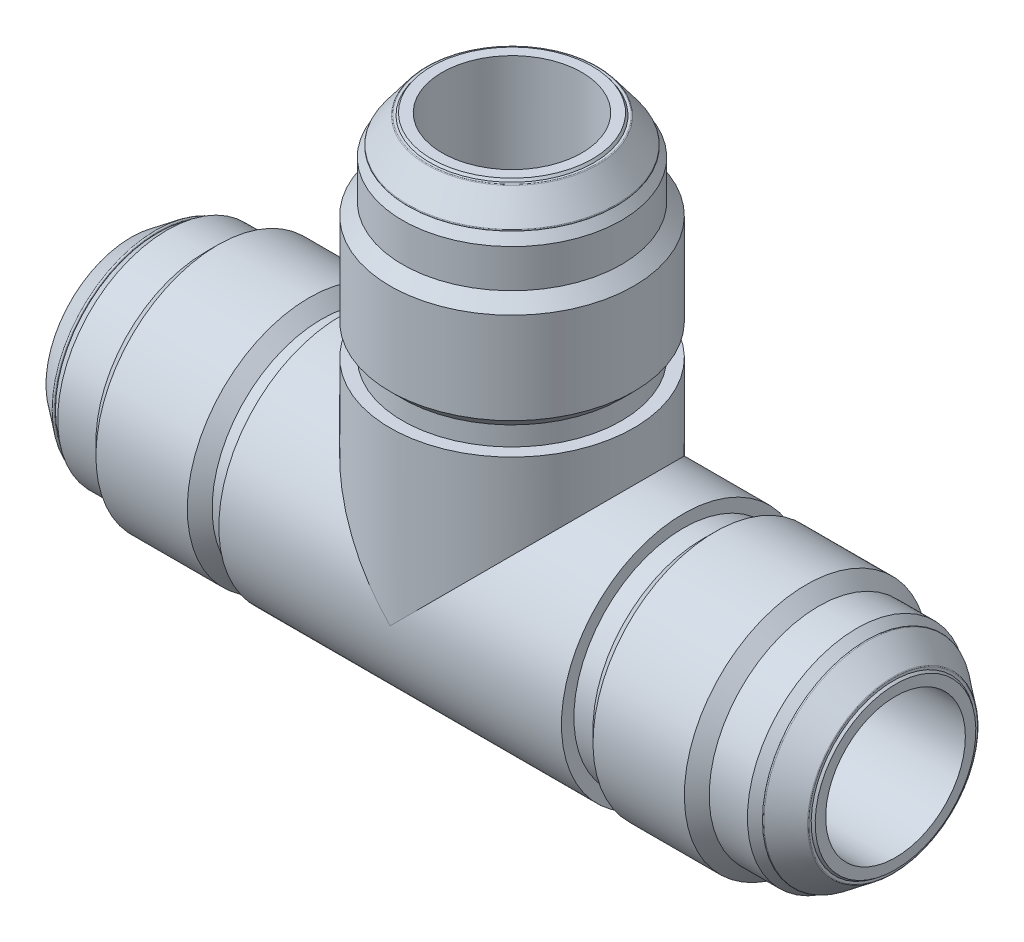
ISO-10303-21;
HEADER;
FILE_DESCRIPTION(('STEP AP214'),'2;1');
FILE_NAME('part.step','',(''),(''),'','','');
FILE_SCHEMA(('AUTOMOTIVE_DESIGN { 1 0 10303 214 1 1 1 1 }'));
ENDSEC;
DATA;
#1=APPLICATION_CONTEXT('core data for automotive mechanical design processes');
#2=APPLICATION_PROTOCOL_DEFINITION('international standard','automotive_design',2000,#1);
#3=PRODUCT_CONTEXT('',#1,'mechanical');
#4=PRODUCT('Part','Part','',(#3));
#5=PRODUCT_RELATED_PRODUCT_CATEGORY('part','',(#4));
#6=PRODUCT_DEFINITION_FORMATION('','',#4);
#7=PRODUCT_DEFINITION_CONTEXT('part definition',#1,'design');
#8=PRODUCT_DEFINITION('design','',#6,#7);
#9=PRODUCT_DEFINITION_SHAPE('','',#8);
#10=(LENGTH_UNIT() NAMED_UNIT(*) SI_UNIT(.MILLI.,.METRE.));
#11=(NAMED_UNIT(*) PLANE_ANGLE_UNIT() SI_UNIT($,.RADIAN.));
#12=(NAMED_UNIT(*) SI_UNIT($,.STERADIAN.) SOLID_ANGLE_UNIT());
#13=UNCERTAINTY_MEASURE_WITH_UNIT(LENGTH_MEASURE(1.E-05),#10,'distance_accuracy_value','');
#14=(GEOMETRIC_REPRESENTATION_CONTEXT(3) GLOBAL_UNCERTAINTY_ASSIGNED_CONTEXT((#13)) GLOBAL_UNIT_ASSIGNED_CONTEXT((#10,
#11,#12)) REPRESENTATION_CONTEXT('',''));
#15=CARTESIAN_POINT('',(0.,0.,0.));
#16=DIRECTION('',(0.,0.,1.));
#17=DIRECTION('',(1.,0.,0.));
#18=AXIS2_PLACEMENT_3D('',#15,#16,#17);
#19=CARTESIAN_POINT('',(0.,0.,0.));
#20=DIRECTION('',(0.,1.,0.));
#21=DIRECTION('',(0.,0.,1.));
#22=AXIS2_PLACEMENT_3D('',#19,#20,#21);
#23=CYLINDRICAL_SURFACE('',#22,13.49375);
#24=CARTESIAN_POINT('',(0.,18.970625,0.));
#25=DIRECTION('',(0.,-1.,0.));
#26=DIRECTION('',(0.,0.,-1.));
#27=AXIS2_PLACEMENT_3D('',#24,#25,#26);
#28=CIRCLE('',#27,13.49375);
#29=CARTESIAN_POINT('',(0.,18.970625,-13.49375));
#30=VERTEX_POINT('',#29);
#31=EDGE_CURVE('E173',#30,#30,#28,.T.);
#32=ORIENTED_EDGE('',*,*,#31,.T.);
#33=EDGE_LOOP('',(#32));
#34=FACE_BOUND('',#33,.T.);
#35=CARTESIAN_POINT('',(0.,0.,0.));
#36=DIRECTION('',(-0.707106781186546,0.707106781186549,0.));
#37=DIRECTION('',(0.707106781186549,0.707106781186546,0.));
#38=AXIS2_PLACEMENT_3D('',#35,#36,#37);
#39=ELLIPSE('',#38,19.083044257272,13.49375);
#40=CARTESIAN_POINT('',(0.,0.,-13.49375));
#41=VERTEX_POINT('',#40);
#42=CARTESIAN_POINT('',(0.,0.,13.49375));
#43=VERTEX_POINT('',#42);
#44=EDGE_CURVE('E168',#41,#43,#39,.F.);
#45=ORIENTED_EDGE('',*,*,#44,.F.);
#46=CARTESIAN_POINT('',(0.,0.,0.));
#47=DIRECTION('',(0.707106781186549,0.707106781186546,0.));
#48=DIRECTION('',(-0.707106781186546,0.707106781186549,0.));
#49=AXIS2_PLACEMENT_3D('',#46,#47,#48);
#50=ELLIPSE('',#49,19.0830442572719,13.49375);
#51=EDGE_CURVE('E59',#43,#41,#50,.F.);
#52=ORIENTED_EDGE('',*,*,#51,.F.);
#53=EDGE_LOOP('',(#45,#52));
#54=FACE_BOUND('',#53,.T.);
#55=ADVANCED_FACE('F40',(#34,#54),#23,.T.);
#56=CARTESIAN_POINT('',(1.4826793722981E-13,42.465625,0.));
#57=DIRECTION('',(0.,-1.,0.));
#58=DIRECTION('',(0.,0.,-1.));
#59=AXIS2_PLACEMENT_3D('',#56,#57,#58);
#60=CYLINDRICAL_SURFACE('',#59,7.7343);
#61=CARTESIAN_POINT('',(1.4826793722981E-13,42.465625,0.));
#62=DIRECTION('',(0.,-1.,0.));
#63=DIRECTION('',(0.,0.,-1.));
#64=AXIS2_PLACEMENT_3D('',#61,#62,#63);
#65=CIRCLE('',#64,7.7343);
#66=CARTESIAN_POINT('',(1.4826793722981E-13,42.465625,-7.7343));
#67=VERTEX_POINT('',#66);
#68=EDGE_CURVE('E170',#67,#67,#65,.T.);
#69=ORIENTED_EDGE('',*,*,#68,.F.);
#70=EDGE_LOOP('',(#69));
#71=FACE_BOUND('',#70,.T.);
#72=CARTESIAN_POINT('',(0.,0.,0.));
#73=DIRECTION('',(-0.707106781186549,-0.707106781186546,0.));
#74=DIRECTION('',(-0.707106781186546,0.707106781186549,0.));
#75=AXIS2_PLACEMENT_3D('',#72,#73,#74);
#76=ELLIPSE('',#75,10.9379519554622,7.7343);
#77=CARTESIAN_POINT('',(0.,0.,-7.7343));
#78=VERTEX_POINT('',#77);
#79=CARTESIAN_POINT('',(0.,0.,7.7343));
#80=VERTEX_POINT('',#79);
#81=EDGE_CURVE('E48',#78,#80,#76,.F.);
#82=ORIENTED_EDGE('',*,*,#81,.F.);
#83=CARTESIAN_POINT('',(0.,0.,0.));
#84=DIRECTION('',(-0.707106781186546,0.707106781186549,0.));
#85=DIRECTION('',(-0.707106781186549,-0.707106781186546,0.));
#86=AXIS2_PLACEMENT_3D('',#83,#84,#85);
#87=ELLIPSE('',#86,10.9379519554622,7.7343);
#88=EDGE_CURVE('E11',#80,#78,#87,.T.);
#89=ORIENTED_EDGE('',*,*,#88,.F.);
#90=EDGE_LOOP('',(#82,#89));
#91=FACE_BOUND('',#90,.T.);
#92=ADVANCED_FACE('F64',(#71,#91),#60,.F.);
#93=CARTESIAN_POINT('',(0.,18.970625,0.));
#94=DIRECTION('',(0.,1.,0.));
#95=DIRECTION('',(0.,0.,1.));
#96=AXIS2_PLACEMENT_3D('',#93,#94,#95);
#97=CYLINDRICAL_SURFACE('',#96,13.49375);
#98=CARTESIAN_POINT('',(0.,22.4621069951745,0.));
#99=DIRECTION('',(0.,-1.,0.));
#100=DIRECTION('',(1.,0.,0.));
#101=AXIS2_PLACEMENT_3D('',#98,#99,#100);
#102=CIRCLE('',#101,13.49375);
#103=CARTESIAN_POINT('',(13.4937500000001,22.4621069951744,0.));
#104=VERTEX_POINT('',#103);
#105=EDGE_CURVE('E182',#104,#104,#102,.T.);
#106=ORIENTED_EDGE('',*,*,#105,.F.);
#107=EDGE_LOOP('',(#106));
#108=FACE_BOUND('',#107,.T.);
#109=CARTESIAN_POINT('',(1.10767937361949E-13,32.5784340172366,0.));
#110=DIRECTION('',(0.,-1.,0.));
#111=DIRECTION('',(1.,0.,0.));
#112=AXIS2_PLACEMENT_3D('',#109,#110,#111);
#113=CIRCLE('',#112,13.49375);
#114=CARTESIAN_POINT('',(13.4937500000001,32.5784340172365,0.));
#115=VERTEX_POINT('',#114);
#116=EDGE_CURVE('E185',#115,#115,#113,.T.);
#117=ORIENTED_EDGE('',*,*,#116,.T.);
#118=EDGE_LOOP('',(#117));
#119=FACE_BOUND('',#118,.T.);
#120=ADVANCED_FACE('F42',(#108,#119),#97,.T.);
#121=CARTESIAN_POINT('',(1.15442362722966E-13,33.9532493457444,0.));
#122=DIRECTION('',(0.,-1.,0.));
#123=DIRECTION('',(1.,0.,0.));
#124=AXIS2_PLACEMENT_3D('',#121,#122,#123);
#125=CONICAL_SURFACE('',#124,12.1189346714922,0.78539816339745);
#126=ORIENTED_EDGE('',*,*,#116,.F.);
#127=EDGE_LOOP('',(#126));
#128=FACE_BOUND('',#127,.T.);
#129=CARTESIAN_POINT('',(1.15442362722966E-13,33.9532493457444,0.));
#130=DIRECTION('',(0.,-1.,0.));
#131=DIRECTION('',(1.,0.,0.));
#132=AXIS2_PLACEMENT_3D('',#129,#130,#131);
#133=CIRCLE('',#132,12.1189346714922);
#134=CARTESIAN_POINT('',(12.1189346714923,33.9532493457444,0.));
#135=VERTEX_POINT('',#134);
#136=EDGE_CURVE('E66',#135,#135,#133,.T.);
#137=ORIENTED_EDGE('',*,*,#136,.T.);
#138=EDGE_LOOP('',(#137));
#139=FACE_BOUND('',#138,.T.);
#140=ADVANCED_FACE('F215',(#128,#139),#125,.T.);
#141=CARTESIAN_POINT('',(0.,0.,0.));
#142=DIRECTION('',(0.,-1.,0.));
#143=DIRECTION('',(1.,0.,0.));
#144=AXIS2_PLACEMENT_3D('',#141,#142,#143);
#145=CYLINDRICAL_SURFACE('',#144,12.1189346714922);
#146=ORIENTED_EDGE('',*,*,#136,.F.);
#147=EDGE_LOOP('',(#146));
#148=FACE_BOUND('',#147,.T.);
#149=CARTESIAN_POINT('',(1.2983586000558E-13,38.1865826790777,0.));
#150=DIRECTION('',(0.,-1.,0.));
#151=DIRECTION('',(1.,0.,0.));
#152=AXIS2_PLACEMENT_3D('',#149,#150,#151);
#153=CIRCLE('',#152,12.1189346714922);
#154=CARTESIAN_POINT('',(12.1189346714923,38.1865826790777,0.));
#155=VERTEX_POINT('',#154);
#156=EDGE_CURVE('E209',#155,#155,#153,.T.);
#157=ORIENTED_EDGE('',*,*,#156,.T.);
#158=EDGE_LOOP('',(#157));
#159=FACE_BOUND('',#158,.T.);
#160=ADVANCED_FACE('F217',(#148,#159),#145,.T.);
#161=CARTESIAN_POINT('',(1.33290299353407E-13,39.2025826790777,0.));
#162=DIRECTION('',(0.,-1.,0.));
#163=DIRECTION('',(1.,0.,0.));
#164=AXIS2_PLACEMENT_3D('',#161,#162,#163);
#165=CONICAL_SURFACE('',#164,11.3533237565878,0.645771823237896);
#166=ORIENTED_EDGE('',*,*,#156,.F.);
#167=EDGE_LOOP('',(#166));
#168=FACE_BOUND('',#167,.T.);
#169=CARTESIAN_POINT('',(1.33290299353407E-13,39.2025826790777,0.));
#170=DIRECTION('',(0.,-1.,0.));
#171=DIRECTION('',(1.,0.,0.));
#172=AXIS2_PLACEMENT_3D('',#169,#170,#171);
#173=CIRCLE('',#172,11.3533237565878);
#174=CARTESIAN_POINT('',(11.3533237565879,39.2025826790777,0.));
#175=VERTEX_POINT('',#174);
#176=EDGE_CURVE('E206',#175,#175,#173,.T.);
#177=ORIENTED_EDGE('',*,*,#176,.T.);
#178=EDGE_LOOP('',(#177));
#179=FACE_BOUND('',#178,.T.);
#180=ADVANCED_FACE('F220',(#168,#179),#165,.T.);
#181=CARTESIAN_POINT('',(11.4166436208107,39.2025826790777,0.));
#182=DIRECTION('',(0.,1.,0.));
#183=DIRECTION('',(-1.,0.,0.));
#184=AXIS2_PLACEMENT_3D('',#181,#182,#183);
#185=PLANE('',#184);
#186=ORIENTED_EDGE('',*,*,#176,.F.);
#187=EDGE_LOOP('',(#186));
#188=FACE_BOUND('',#187,.T.);
#189=CARTESIAN_POINT('',(1.33290299353407E-13,39.2025826790777,0.));
#190=DIRECTION('',(0.,-1.,0.));
#191=DIRECTION('',(1.,0.,0.));
#192=AXIS2_PLACEMENT_3D('',#189,#190,#191);
#193=CIRCLE('',#192,11.4166436208106);
#194=CARTESIAN_POINT('',(11.4166436208107,39.2025826790777,0.));
#195=VERTEX_POINT('',#194);
#196=EDGE_CURVE('E203',#195,#195,#193,.T.);
#197=ORIENTED_EDGE('',*,*,#196,.T.);
#198=EDGE_LOOP('',(#197));
#199=FACE_BOUND('',#198,.T.);
#200=ADVANCED_FACE('F226',(#188,#199),#185,.F.);
#201=CARTESIAN_POINT('',(1.33849057036534E-13,39.3295826790777,0.));
#202=DIRECTION('',(0.,-1.,0.));
#203=DIRECTION('',(1.,0.,0.));
#204=AXIS2_PLACEMENT_3D('',#201,#202,#203);
#205=TOROIDAL_SURFACE('',#204,11.4166436208106,0.127000000000006);
#206=ORIENTED_EDGE('',*,*,#196,.F.);
#207=EDGE_LOOP('',(#206));
#208=FACE_BOUND('',#207,.T.);
#209=CARTESIAN_POINT('',(1.33981970958897E-13,39.4060131870181,0.));
#210=DIRECTION('',(0.,-1.,0.));
#211=DIRECTION('',(1.,0.,0.));
#212=AXIS2_PLACEMENT_3D('',#209,#210,#211);
#213=CIRCLE('',#212,11.5180703305866);
#214=CARTESIAN_POINT('',(11.5180703305867,39.406013187018,0.));
#215=VERTEX_POINT('',#214);
#216=EDGE_CURVE('E200',#215,#215,#213,.T.);
#217=ORIENTED_EDGE('',*,*,#216,.T.);
#218=EDGE_LOOP('',(#217));
#219=FACE_BOUND('',#218,.T.);
#220=ADVANCED_FACE('F232',(#208,#219),#205,.T.);
#221=CARTESIAN_POINT('',(1.43349221547798E-13,42.1610555079403,0.));
#222=DIRECTION('',(0.,-1.,0.));
#223=DIRECTION('',(1.,0.,0.));
#224=AXIS2_PLACEMENT_3D('',#221,#222,#223);
#225=CONICAL_SURFACE('',#224,9.44199703145101,0.645771823237899);
#226=ORIENTED_EDGE('',*,*,#216,.F.);
#227=EDGE_LOOP('',(#226));
#228=FACE_BOUND('',#227,.T.);
#229=CARTESIAN_POINT('',(1.43349221547798E-13,42.1610555079403,0.));
#230=DIRECTION('',(0.,-1.,0.));
#231=DIRECTION('',(1.,0.,0.));
#232=AXIS2_PLACEMENT_3D('',#229,#230,#231);
#233=CIRCLE('',#232,9.44199703145101);
#234=CARTESIAN_POINT('',(9.44199703145115,42.1610555079403,0.));
#235=VERTEX_POINT('',#234);
#236=EDGE_CURVE('E197',#235,#235,#233,.T.);
#237=ORIENTED_EDGE('',*,*,#236,.T.);
#238=EDGE_LOOP('',(#237));
#239=FACE_BOUND('',#238,.T.);
#240=ADVANCED_FACE('F238',(#228,#239),#225,.T.);
#241=CARTESIAN_POINT('',(1.43468235887758E-13,42.084625,0.));
#242=DIRECTION('',(0.,-1.,0.));
#243=DIRECTION('',(1.,0.,0.));
#244=AXIS2_PLACEMENT_3D('',#241,#242,#243);
#245=TOROIDAL_SURFACE('',#244,9.340570321675,0.127000000000001);
#246=ORIENTED_EDGE('',*,*,#236,.F.);
#247=EDGE_LOOP('',(#246));
#248=FACE_BOUND('',#247,.T.);
#249=CARTESIAN_POINT('',(1.43521159779265E-13,42.211625,0.));
#250=DIRECTION('',(0.,-1.,0.));
#251=DIRECTION('',(1.,0.,0.));
#252=AXIS2_PLACEMENT_3D('',#249,#250,#251);
#253=CIRCLE('',#252,9.340570321675);
#254=CARTESIAN_POINT('',(9.34057032167515,42.211625,0.));
#255=VERTEX_POINT('',#254);
#256=EDGE_CURVE('E194',#255,#255,#253,.T.);
#257=ORIENTED_EDGE('',*,*,#256,.T.);
#258=EDGE_LOOP('',(#257));
#259=FACE_BOUND('',#258,.T.);
#260=ADVANCED_FACE('F244',(#248,#259),#245,.T.);
#261=CARTESIAN_POINT('',(9.34057032167515,42.211625,0.));
#262=DIRECTION('',(0.,-1.,0.));
#263=DIRECTION('',(1.,0.,0.));
#264=AXIS2_PLACEMENT_3D('',#261,#262,#263);
#265=PLANE('',#264);
#266=ORIENTED_EDGE('',*,*,#256,.F.);
#267=EDGE_LOOP('',(#266));
#268=FACE_BOUND('',#267,.T.);
#269=CARTESIAN_POINT('',(1.43521159779265E-13,42.211625,0.));
#270=DIRECTION('',(0.,-1.,0.));
#271=DIRECTION('',(1.,0.,0.));
#272=AXIS2_PLACEMENT_3D('',#269,#270,#271);
#273=CIRCLE('',#272,9.08584772872612);
#274=CARTESIAN_POINT('',(9.08584772872626,42.211625,0.));
#275=VERTEX_POINT('',#274);
#276=EDGE_CURVE('E191',#275,#275,#273,.T.);
#277=ORIENTED_EDGE('',*,*,#276,.T.);
#278=EDGE_LOOP('',(#277));
#279=FACE_BOUND('',#278,.T.);
#280=ADVANCED_FACE('F250',(#268,#279),#265,.F.);
#281=CARTESIAN_POINT('',(1.44384769616222E-13,42.465625,0.));
#282=DIRECTION('',(0.,-1.,0.));
#283=DIRECTION('',(1.,0.,0.));
#284=AXIS2_PLACEMENT_3D('',#281,#282,#283);
#285=CONICAL_SURFACE('',#284,8.894445,0.645771823237914);
#286=ORIENTED_EDGE('',*,*,#276,.F.);
#287=EDGE_LOOP('',(#286));
#288=FACE_BOUND('',#287,.T.);
#289=CARTESIAN_POINT('',(1.44384769616222E-13,42.465625,0.));
#290=DIRECTION('',(0.,-1.,0.));
#291=DIRECTION('',(1.,0.,0.));
#292=AXIS2_PLACEMENT_3D('',#289,#290,#291);
#293=CIRCLE('',#292,8.894445);
#294=CARTESIAN_POINT('',(8.89444500000015,42.465625,0.));
#295=VERTEX_POINT('',#294);
#296=EDGE_CURVE('E188',#295,#295,#293,.T.);
#297=ORIENTED_EDGE('',*,*,#296,.T.);
#298=EDGE_LOOP('',(#297));
#299=FACE_BOUND('',#298,.T.);
#300=ADVANCED_FACE('F256',(#288,#299),#285,.T.);
#301=CARTESIAN_POINT('',(1.4826793722981E-13,42.465625,0.));
#302=DIRECTION('',(0.,-1.,0.));
#303=DIRECTION('',(0.,0.,-1.));
#304=AXIS2_PLACEMENT_3D('',#301,#302,#303);
#305=PLANE('',#304);
#306=ORIENTED_EDGE('',*,*,#68,.T.);
#307=EDGE_LOOP('',(#306));
#308=FACE_BOUND('',#307,.T.);
#309=ORIENTED_EDGE('',*,*,#296,.F.);
#310=EDGE_LOOP('',(#309));
#311=FACE_BOUND('',#310,.T.);
#312=ADVANCED_FACE('F262',(#308,#311),#305,.F.);
#313=CARTESIAN_POINT('',(0.,22.4621069951745,0.));
#314=DIRECTION('',(0.,1.,0.));
#315=DIRECTION('',(-1.,0.,0.));
#316=AXIS2_PLACEMENT_3D('',#313,#314,#315);
#317=CONICAL_SURFACE('',#316,13.49375,0.785398163397451);
#318=CARTESIAN_POINT('',(0.,21.0872916666667,0.));
#319=DIRECTION('',(0.,-1.,0.));
#320=DIRECTION('',(1.,0.,0.));
#321=AXIS2_PLACEMENT_3D('',#318,#319,#320);
#322=CIRCLE('',#321,12.1189346714922);
#323=CARTESIAN_POINT('',(12.1189346714923,21.0872916666666,0.));
#324=VERTEX_POINT('',#323);
#325=EDGE_CURVE('E179',#324,#324,#322,.T.);
#326=ORIENTED_EDGE('',*,*,#325,.F.);
#327=EDGE_LOOP('',(#326));
#328=FACE_BOUND('',#327,.T.);
#329=ORIENTED_EDGE('',*,*,#105,.T.);
#330=EDGE_LOOP('',(#329));
#331=FACE_BOUND('',#330,.T.);
#332=ADVANCED_FACE('F267',(#328,#331),#317,.T.);
#333=CARTESIAN_POINT('',(0.,0.,0.));
#334=DIRECTION('',(0.,-1.,0.));
#335=DIRECTION('',(1.,0.,0.));
#336=AXIS2_PLACEMENT_3D('',#333,#334,#335);
#337=CYLINDRICAL_SURFACE('',#336,12.1189346714922);
#338=CARTESIAN_POINT('',(0.,18.970625,0.));
#339=DIRECTION('',(0.,-1.,0.));
#340=DIRECTION('',(1.,0.,0.));
#341=AXIS2_PLACEMENT_3D('',#338,#339,#340);
#342=CIRCLE('',#341,12.1189346714922);
#343=CARTESIAN_POINT('',(12.1189346714923,18.970625,0.));
#344=VERTEX_POINT('',#343);
#345=EDGE_CURVE('E176',#344,#344,#342,.T.);
#346=ORIENTED_EDGE('',*,*,#345,.F.);
#347=EDGE_LOOP('',(#346));
#348=FACE_BOUND('',#347,.T.);
#349=ORIENTED_EDGE('',*,*,#325,.T.);
#350=EDGE_LOOP('',(#349));
#351=FACE_BOUND('',#350,.T.);
#352=ADVANCED_FACE('F272',(#348,#351),#337,.T.);
#353=CARTESIAN_POINT('',(0.,18.970625,0.));
#354=DIRECTION('',(0.,-1.,0.));
#355=DIRECTION('',(0.,0.,-1.));
#356=AXIS2_PLACEMENT_3D('',#353,#354,#355);
#357=PLANE('',#356);
#358=ORIENTED_EDGE('',*,*,#31,.F.);
#359=EDGE_LOOP('',(#358));
#360=FACE_BOUND('',#359,.T.);
#361=ORIENTED_EDGE('',*,*,#345,.T.);
#362=EDGE_LOOP('',(#361));
#363=FACE_BOUND('',#362,.T.);
#364=ADVANCED_FACE('F286',(#360,#363),#357,.F.);
#365=CARTESIAN_POINT('',(0.,0.,0.));
#366=DIRECTION('',(-1.,0.,0.));
#367=DIRECTION('',(0.,0.,1.));
#368=AXIS2_PLACEMENT_3D('',#365,#366,#367);
#369=CYLINDRICAL_SURFACE('',#368,13.49375);
#370=CARTESIAN_POINT('',(18.970625,-1.29001719395428E-13,0.));
#371=DIRECTION('',(-1.,0.,0.));
#372=DIRECTION('',(0.,0.,-1.));
#373=AXIS2_PLACEMENT_3D('',#370,#371,#372);
#374=CIRCLE('',#373,13.49375);
#375=CARTESIAN_POINT('',(18.970625,-1.29001719395428E-13,-13.49375));
#376=VERTEX_POINT('',#375);
#377=EDGE_CURVE('E80',#376,#376,#374,.T.);
#378=ORIENTED_EDGE('',*,*,#377,.T.);
#379=EDGE_LOOP('',(#378));
#380=FACE_BOUND('',#379,.T.);
#381=CARTESIAN_POINT('',(-18.970625,0.,0.));
#382=DIRECTION('',(1.,0.,0.));
#383=DIRECTION('',(0.,0.,-1.));
#384=AXIS2_PLACEMENT_3D('',#381,#382,#383);
#385=CIRCLE('',#384,13.49375);
#386=CARTESIAN_POINT('',(-18.970625,0.,-13.49375));
#387=VERTEX_POINT('',#386);
#388=EDGE_CURVE('E125',#387,#387,#385,.T.);
#389=ORIENTED_EDGE('',*,*,#388,.T.);
#390=EDGE_LOOP('',(#389));
#391=FACE_BOUND('',#390,.T.);
#392=ORIENTED_EDGE('',*,*,#51,.T.);
#393=ORIENTED_EDGE('',*,*,#44,.T.);
#394=EDGE_LOOP('',(#392,#393));
#395=FACE_BOUND('',#394,.T.);
#396=ADVANCED_FACE('F512',(#380,#391,#395),#369,.T.);
#397=CARTESIAN_POINT('',(-18.970625,0.,0.));
#398=DIRECTION('',(-1.,0.,0.));
#399=DIRECTION('',(0.,0.,1.));
#400=AXIS2_PLACEMENT_3D('',#397,#398,#399);
#401=CYLINDRICAL_SURFACE('',#400,13.49375);
#402=CARTESIAN_POINT('',(-22.4621069951745,0.,0.));
#403=DIRECTION('',(1.,0.,0.));
#404=DIRECTION('',(0.,1.,0.));
#405=AXIS2_PLACEMENT_3D('',#402,#403,#404);
#406=CIRCLE('',#405,13.49375);
#407=CARTESIAN_POINT('',(-22.4621069951745,13.49375,0.));
#408=VERTEX_POINT('',#407);
#409=EDGE_CURVE('E134',#408,#408,#406,.T.);
#410=ORIENTED_EDGE('',*,*,#409,.F.);
#411=EDGE_LOOP('',(#410));
#412=FACE_BOUND('',#411,.T.);
#413=CARTESIAN_POINT('',(-32.5784340172366,0.,0.));
#414=DIRECTION('',(1.,0.,0.));
#415=DIRECTION('',(0.,1.,0.));
#416=AXIS2_PLACEMENT_3D('',#413,#414,#415);
#417=CIRCLE('',#416,13.49375);
#418=CARTESIAN_POINT('',(-32.5784340172366,13.49375,0.));
#419=VERTEX_POINT('',#418);
#420=EDGE_CURVE('E137',#419,#419,#417,.T.);
#421=ORIENTED_EDGE('',*,*,#420,.T.);
#422=EDGE_LOOP('',(#421));
#423=FACE_BOUND('',#422,.T.);
#424=ADVANCED_FACE('F505',(#412,#423),#401,.T.);
#425=CARTESIAN_POINT('',(-33.9532493457444,0.,0.));
#426=DIRECTION('',(1.,0.,0.));
#427=DIRECTION('',(0.,1.,0.));
#428=AXIS2_PLACEMENT_3D('',#425,#426,#427);
#429=CONICAL_SURFACE('',#428,12.1189346714922,0.78539816339745);
#430=ORIENTED_EDGE('',*,*,#420,.F.);
#431=EDGE_LOOP('',(#430));
#432=FACE_BOUND('',#431,.T.);
#433=CARTESIAN_POINT('',(-33.9532493457444,0.,0.));
#434=DIRECTION('',(1.,0.,0.));
#435=DIRECTION('',(0.,1.,0.));
#436=AXIS2_PLACEMENT_3D('',#433,#434,#435);
#437=CIRCLE('',#436,12.1189346714922);
#438=CARTESIAN_POINT('',(-33.9532493457444,12.1189346714922,0.));
#439=VERTEX_POINT('',#438);
#440=EDGE_CURVE('E164',#439,#439,#437,.T.);
#441=ORIENTED_EDGE('',*,*,#440,.T.);
#442=EDGE_LOOP('',(#441));
#443=FACE_BOUND('',#442,.T.);
#444=ADVANCED_FACE('F498',(#432,#443),#429,.T.);
#445=CARTESIAN_POINT('',(0.,0.,0.));
#446=DIRECTION('',(1.,0.,0.));
#447=DIRECTION('',(0.,1.,0.));
#448=AXIS2_PLACEMENT_3D('',#445,#446,#447);
#449=CYLINDRICAL_SURFACE('',#448,12.1189346714922);
#450=ORIENTED_EDGE('',*,*,#440,.F.);
#451=EDGE_LOOP('',(#450));
#452=FACE_BOUND('',#451,.T.);
#453=CARTESIAN_POINT('',(-38.1865826790777,0.,0.));
#454=DIRECTION('',(1.,0.,0.));
#455=DIRECTION('',(0.,1.,0.));
#456=AXIS2_PLACEMENT_3D('',#453,#454,#455);
#457=CIRCLE('',#456,12.1189346714922);
#458=CARTESIAN_POINT('',(-38.1865826790777,12.1189346714922,0.));
#459=VERTEX_POINT('',#458);
#460=EDGE_CURVE('E161',#459,#459,#457,.T.);
#461=ORIENTED_EDGE('',*,*,#460,.T.);
#462=EDGE_LOOP('',(#461));
#463=FACE_BOUND('',#462,.T.);
#464=ADVANCED_FACE('F491',(#452,#463),#449,.T.);
#465=CARTESIAN_POINT('',(-39.2025826790777,0.,0.));
#466=DIRECTION('',(1.,0.,0.));
#467=DIRECTION('',(0.,1.,0.));
#468=AXIS2_PLACEMENT_3D('',#465,#466,#467);
#469=CONICAL_SURFACE('',#468,11.3533237565878,0.645771823237896);
#470=ORIENTED_EDGE('',*,*,#460,.F.);
#471=EDGE_LOOP('',(#470));
#472=FACE_BOUND('',#471,.T.);
#473=CARTESIAN_POINT('',(-39.2025826790777,0.,0.));
#474=DIRECTION('',(1.,0.,0.));
#475=DIRECTION('',(0.,1.,0.));
#476=AXIS2_PLACEMENT_3D('',#473,#474,#475);
#477=CIRCLE('',#476,11.3533237565878);
#478=CARTESIAN_POINT('',(-39.2025826790777,11.3533237565878,0.));
#479=VERTEX_POINT('',#478);
#480=EDGE_CURVE('E158',#479,#479,#477,.T.);
#481=ORIENTED_EDGE('',*,*,#480,.T.);
#482=EDGE_LOOP('',(#481));
#483=FACE_BOUND('',#482,.T.);
#484=ADVANCED_FACE('F484',(#472,#483),#469,.T.);
#485=CARTESIAN_POINT('',(-39.2025826790777,11.4166436208105,0.));
#486=DIRECTION('',(-1.,0.,0.));
#487=DIRECTION('',(0.,-1.,0.));
#488=AXIS2_PLACEMENT_3D('',#485,#486,#487);
#489=PLANE('',#488);
#490=ORIENTED_EDGE('',*,*,#480,.F.);
#491=EDGE_LOOP('',(#490));
#492=FACE_BOUND('',#491,.T.);
#493=CARTESIAN_POINT('',(-39.2025826790777,0.,0.));
#494=DIRECTION('',(1.,0.,0.));
#495=DIRECTION('',(0.,1.,0.));
#496=AXIS2_PLACEMENT_3D('',#493,#494,#495);
#497=CIRCLE('',#496,11.4166436208106);
#498=CARTESIAN_POINT('',(-39.2025826790777,11.4166436208105,0.));
#499=VERTEX_POINT('',#498);
#500=EDGE_CURVE('E155',#499,#499,#497,.T.);
#501=ORIENTED_EDGE('',*,*,#500,.T.);
#502=EDGE_LOOP('',(#501));
#503=FACE_BOUND('',#502,.T.);
#504=ADVANCED_FACE('F477',(#492,#503),#489,.F.);
#505=CARTESIAN_POINT('',(-39.3295826790777,0.,0.));
#506=DIRECTION('',(1.,0.,0.));
#507=DIRECTION('',(0.,1.,0.));
#508=AXIS2_PLACEMENT_3D('',#505,#506,#507);
#509=TOROIDAL_SURFACE('',#508,11.4166436208106,0.127000000000006);
#510=ORIENTED_EDGE('',*,*,#500,.F.);
#511=EDGE_LOOP('',(#510));
#512=FACE_BOUND('',#511,.T.);
#513=CARTESIAN_POINT('',(-39.4060131870181,0.,0.));
#514=DIRECTION('',(1.,0.,0.));
#515=DIRECTION('',(0.,1.,0.));
#516=AXIS2_PLACEMENT_3D('',#513,#514,#515);
#517=CIRCLE('',#516,11.5180703305866);
#518=CARTESIAN_POINT('',(-39.4060131870181,11.5180703305866,0.));
#519=VERTEX_POINT('',#518);
#520=EDGE_CURVE('E152',#519,#519,#517,.T.);
#521=ORIENTED_EDGE('',*,*,#520,.T.);
#522=EDGE_LOOP('',(#521));
#523=FACE_BOUND('',#522,.T.);
#524=ADVANCED_FACE('F470',(#512,#523),#509,.T.);
#525=CARTESIAN_POINT('',(-42.1610555079403,0.,0.));
#526=DIRECTION('',(1.,0.,0.));
#527=DIRECTION('',(0.,1.,0.));
#528=AXIS2_PLACEMENT_3D('',#525,#526,#527);
#529=CONICAL_SURFACE('',#528,9.44199703145101,0.645771823237899);
#530=ORIENTED_EDGE('',*,*,#520,.F.);
#531=EDGE_LOOP('',(#530));
#532=FACE_BOUND('',#531,.T.);
#533=CARTESIAN_POINT('',(-42.1610555079403,0.,0.));
#534=DIRECTION('',(1.,0.,0.));
#535=DIRECTION('',(0.,1.,0.));
#536=AXIS2_PLACEMENT_3D('',#533,#534,#535);
#537=CIRCLE('',#536,9.44199703145101);
#538=CARTESIAN_POINT('',(-42.1610555079403,9.44199703145101,0.));
#539=VERTEX_POINT('',#538);
#540=EDGE_CURVE('E149',#539,#539,#537,.T.);
#541=ORIENTED_EDGE('',*,*,#540,.T.);
#542=EDGE_LOOP('',(#541));
#543=FACE_BOUND('',#542,.T.);
#544=ADVANCED_FACE('F463',(#532,#543),#529,.T.);
#545=CARTESIAN_POINT('',(-42.084625,0.,0.));
#546=DIRECTION('',(1.,0.,0.));
#547=DIRECTION('',(0.,1.,0.));
#548=AXIS2_PLACEMENT_3D('',#545,#546,#547);
#549=TOROIDAL_SURFACE('',#548,9.340570321675,0.127000000000001);
#550=ORIENTED_EDGE('',*,*,#540,.F.);
#551=EDGE_LOOP('',(#550));
#552=FACE_BOUND('',#551,.T.);
#553=CARTESIAN_POINT('',(-42.211625,0.,0.));
#554=DIRECTION('',(1.,0.,0.));
#555=DIRECTION('',(0.,1.,0.));
#556=AXIS2_PLACEMENT_3D('',#553,#554,#555);
#557=CIRCLE('',#556,9.340570321675);
#558=CARTESIAN_POINT('',(-42.211625,9.340570321675,0.));
#559=VERTEX_POINT('',#558);
#560=EDGE_CURVE('E146',#559,#559,#557,.T.);
#561=ORIENTED_EDGE('',*,*,#560,.T.);
#562=EDGE_LOOP('',(#561));
#563=FACE_BOUND('',#562,.T.);
#564=ADVANCED_FACE('F456',(#552,#563),#549,.T.);
#565=CARTESIAN_POINT('',(-42.211625,9.340570321675,0.));
#566=DIRECTION('',(1.,0.,0.));
#567=DIRECTION('',(0.,1.,0.));
#568=AXIS2_PLACEMENT_3D('',#565,#566,#567);
#569=PLANE('',#568);
#570=ORIENTED_EDGE('',*,*,#560,.F.);
#571=EDGE_LOOP('',(#570));
#572=FACE_BOUND('',#571,.T.);
#573=CARTESIAN_POINT('',(-42.211625,0.,0.));
#574=DIRECTION('',(1.,0.,0.));
#575=DIRECTION('',(0.,1.,0.));
#576=AXIS2_PLACEMENT_3D('',#573,#574,#575);
#577=CIRCLE('',#576,9.08584772872612);
#578=CARTESIAN_POINT('',(-42.211625,9.08584772872611,0.));
#579=VERTEX_POINT('',#578);
#580=EDGE_CURVE('E143',#579,#579,#577,.T.);
#581=ORIENTED_EDGE('',*,*,#580,.T.);
#582=EDGE_LOOP('',(#581));
#583=FACE_BOUND('',#582,.T.);
#584=ADVANCED_FACE('F449',(#572,#583),#569,.F.);
#585=CARTESIAN_POINT('',(-42.465625,0.,0.));
#586=DIRECTION('',(1.,0.,0.));
#587=DIRECTION('',(0.,1.,0.));
#588=AXIS2_PLACEMENT_3D('',#585,#586,#587);
#589=CONICAL_SURFACE('',#588,8.894445,0.645771823237914);
#590=ORIENTED_EDGE('',*,*,#580,.F.);
#591=EDGE_LOOP('',(#590));
#592=FACE_BOUND('',#591,.T.);
#593=CARTESIAN_POINT('',(-42.465625,0.,0.));
#594=DIRECTION('',(1.,0.,0.));
#595=DIRECTION('',(0.,1.,0.));
#596=AXIS2_PLACEMENT_3D('',#593,#594,#595);
#597=CIRCLE('',#596,8.894445);
#598=CARTESIAN_POINT('',(-42.465625,8.894445,0.));
#599=VERTEX_POINT('',#598);
#600=EDGE_CURVE('E140',#599,#599,#597,.T.);
#601=ORIENTED_EDGE('',*,*,#600,.T.);
#602=EDGE_LOOP('',(#601));
#603=FACE_BOUND('',#602,.T.);
#604=ADVANCED_FACE('F442',(#592,#603),#589,.T.);
#605=CARTESIAN_POINT('',(-42.465625,0.,0.));
#606=DIRECTION('',(1.,0.,0.));
#607=DIRECTION('',(0.,0.,-1.));
#608=AXIS2_PLACEMENT_3D('',#605,#606,#607);
#609=PLANE('',#608);
#610=CARTESIAN_POINT('',(-42.465625,0.,0.));
#611=DIRECTION('',(1.,0.,0.));
#612=DIRECTION('',(0.,0.,-1.));
#613=AXIS2_PLACEMENT_3D('',#610,#611,#612);
#614=CIRCLE('',#613,7.7343);
#615=CARTESIAN_POINT('',(-42.465625,0.,-7.7343));
#616=VERTEX_POINT('',#615);
#617=EDGE_CURVE('E75',#616,#616,#614,.T.);
#618=ORIENTED_EDGE('',*,*,#617,.T.);
#619=EDGE_LOOP('',(#618));
#620=FACE_BOUND('',#619,.T.);
#621=ORIENTED_EDGE('',*,*,#600,.F.);
#622=EDGE_LOOP('',(#621));
#623=FACE_BOUND('',#622,.T.);
#624=ADVANCED_FACE('F435',(#620,#623),#609,.F.);
#625=CARTESIAN_POINT('',(-22.4621069951745,0.,0.));
#626=DIRECTION('',(-1.,0.,0.));
#627=DIRECTION('',(0.,-1.,0.));
#628=AXIS2_PLACEMENT_3D('',#625,#626,#627);
#629=CONICAL_SURFACE('',#628,13.49375,0.785398163397451);
#630=CARTESIAN_POINT('',(-21.0872916666667,0.,0.));
#631=DIRECTION('',(1.,0.,0.));
#632=DIRECTION('',(0.,1.,0.));
#633=AXIS2_PLACEMENT_3D('',#630,#631,#632);
#634=CIRCLE('',#633,12.1189346714922);
#635=CARTESIAN_POINT('',(-21.0872916666667,12.1189346714922,0.));
#636=VERTEX_POINT('',#635);
#637=EDGE_CURVE('E131',#636,#636,#634,.T.);
#638=ORIENTED_EDGE('',*,*,#637,.F.);
#639=EDGE_LOOP('',(#638));
#640=FACE_BOUND('',#639,.T.);
#641=ORIENTED_EDGE('',*,*,#409,.T.);
#642=EDGE_LOOP('',(#641));
#643=FACE_BOUND('',#642,.T.);
#644=ADVANCED_FACE('F428',(#640,#643),#629,.T.);
#645=CARTESIAN_POINT('',(0.,0.,0.));
#646=DIRECTION('',(1.,0.,0.));
#647=DIRECTION('',(0.,1.,0.));
#648=AXIS2_PLACEMENT_3D('',#645,#646,#647);
#649=CYLINDRICAL_SURFACE('',#648,12.1189346714922);
#650=CARTESIAN_POINT('',(-18.970625,0.,0.));
#651=DIRECTION('',(1.,0.,0.));
#652=DIRECTION('',(0.,1.,0.));
#653=AXIS2_PLACEMENT_3D('',#650,#651,#652);
#654=CIRCLE('',#653,12.1189346714922);
#655=CARTESIAN_POINT('',(-18.970625,12.1189346714922,0.));
#656=VERTEX_POINT('',#655);
#657=EDGE_CURVE('E128',#656,#656,#654,.T.);
#658=ORIENTED_EDGE('',*,*,#657,.F.);
#659=EDGE_LOOP('',(#658));
#660=FACE_BOUND('',#659,.T.);
#661=ORIENTED_EDGE('',*,*,#637,.T.);
#662=EDGE_LOOP('',(#661));
#663=FACE_BOUND('',#662,.T.);
#664=ADVANCED_FACE('F421',(#660,#663),#649,.T.);
#665=CARTESIAN_POINT('',(-18.970625,0.,0.));
#666=DIRECTION('',(1.,0.,0.));
#667=DIRECTION('',(0.,0.,-1.));
#668=AXIS2_PLACEMENT_3D('',#665,#666,#667);
#669=PLANE('',#668);
#670=ORIENTED_EDGE('',*,*,#388,.F.);
#671=EDGE_LOOP('',(#670));
#672=FACE_BOUND('',#671,.T.);
#673=ORIENTED_EDGE('',*,*,#657,.T.);
#674=EDGE_LOOP('',(#673));
#675=FACE_BOUND('',#674,.T.);
#676=ADVANCED_FACE('F413',(#672,#675),#669,.F.);
#677=CARTESIAN_POINT('',(18.970625,-1.32471166347382E-13,0.));
#678=DIRECTION('',(1.,0.,0.));
#679=DIRECTION('',(0.,0.,1.));
#680=AXIS2_PLACEMENT_3D('',#677,#678,#679);
#681=CYLINDRICAL_SURFACE('',#680,13.49375);
#682=CARTESIAN_POINT('',(22.4621069951745,-1.54798061104788E-13,0.));
#683=DIRECTION('',(-1.,0.,0.));
#684=DIRECTION('',(0.,-1.,0.));
#685=AXIS2_PLACEMENT_3D('',#682,#683,#684);
#686=CIRCLE('',#685,13.49375);
#687=CARTESIAN_POINT('',(22.4621069951744,-13.4937500000002,0.));
#688=VERTEX_POINT('',#687);
#689=EDGE_CURVE('E91',#688,#688,#686,.T.);
#690=ORIENTED_EDGE('',*,*,#689,.F.);
#691=EDGE_LOOP('',(#690));
#692=FACE_BOUND('',#691,.T.);
#693=CARTESIAN_POINT('',(32.5784340172366,-2.24514931781863E-13,0.));
#694=DIRECTION('',(-1.,0.,0.));
#695=DIRECTION('',(0.,-1.,0.));
#696=AXIS2_PLACEMENT_3D('',#693,#694,#695);
#697=CIRCLE('',#696,13.49375);
#698=CARTESIAN_POINT('',(32.5784340172365,-13.4937500000002,0.));
#699=VERTEX_POINT('',#698);
#700=EDGE_CURVE('E94',#699,#699,#697,.T.);
#701=ORIENTED_EDGE('',*,*,#700,.T.);
#702=EDGE_LOOP('',(#701));
#703=FACE_BOUND('',#702,.T.);
#704=ADVANCED_FACE('F405',(#692,#703),#681,.T.);
#705=CARTESIAN_POINT('',(33.9532493457444,-2.3398949920672E-13,0.));
#706=DIRECTION('',(-1.,0.,0.));
#707=DIRECTION('',(0.,-1.,0.));
#708=AXIS2_PLACEMENT_3D('',#705,#706,#707);
#709=CONICAL_SURFACE('',#708,12.1189346714922,0.78539816339745);
#710=ORIENTED_EDGE('',*,*,#700,.F.);
#711=EDGE_LOOP('',(#710));
#712=FACE_BOUND('',#711,.T.);
#713=CARTESIAN_POINT('',(33.9532493457444,-2.3398949920672E-13,0.));
#714=DIRECTION('',(-1.,0.,0.));
#715=DIRECTION('',(0.,-1.,0.));
#716=AXIS2_PLACEMENT_3D('',#713,#714,#715);
#717=CIRCLE('',#716,12.1189346714922);
#718=CARTESIAN_POINT('',(33.9532493457443,-12.1189346714924,0.));
#719=VERTEX_POINT('',#718);
#720=EDGE_CURVE('E121',#719,#719,#717,.T.);
#721=ORIENTED_EDGE('',*,*,#720,.T.);
#722=EDGE_LOOP('',(#721));
#723=FACE_BOUND('',#722,.T.);
#724=ADVANCED_FACE('F398',(#712,#723),#709,.T.);
#725=CARTESIAN_POINT('',(0.,0.,0.));
#726=DIRECTION('',(-1.,0.,0.));
#727=DIRECTION('',(0.,-1.,0.));
#728=AXIS2_PLACEMENT_3D('',#725,#726,#727);
#729=CYLINDRICAL_SURFACE('',#728,12.1189346714922);
#730=ORIENTED_EDGE('',*,*,#720,.F.);
#731=EDGE_LOOP('',(#730));
#732=FACE_BOUND('',#731,.T.);
#733=CARTESIAN_POINT('',(38.1865826790777,-2.6316360082377E-13,0.));
#734=DIRECTION('',(-1.,0.,0.));
#735=DIRECTION('',(0.,-1.,0.));
#736=AXIS2_PLACEMENT_3D('',#733,#734,#735);
#737=CIRCLE('',#736,12.1189346714922);
#738=CARTESIAN_POINT('',(38.1865826790777,-12.1189346714925,0.));
#739=VERTEX_POINT('',#738);
#740=EDGE_CURVE('E118',#739,#739,#737,.T.);
#741=ORIENTED_EDGE('',*,*,#740,.T.);
#742=EDGE_LOOP('',(#741));
#743=FACE_BOUND('',#742,.T.);
#744=ADVANCED_FACE('F391',(#732,#743),#729,.T.);
#745=CARTESIAN_POINT('',(39.2025826790777,-2.70165385211862E-13,0.));
#746=DIRECTION('',(-1.,0.,0.));
#747=DIRECTION('',(0.,-1.,0.));
#748=AXIS2_PLACEMENT_3D('',#745,#746,#747);
#749=CONICAL_SURFACE('',#748,11.3533237565878,0.645771823237896);
#750=ORIENTED_EDGE('',*,*,#740,.F.);
#751=EDGE_LOOP('',(#750));
#752=FACE_BOUND('',#751,.T.);
#753=CARTESIAN_POINT('',(39.2025826790777,-2.70165385211862E-13,0.));
#754=DIRECTION('',(-1.,0.,0.));
#755=DIRECTION('',(0.,-1.,0.));
#756=AXIS2_PLACEMENT_3D('',#753,#754,#755);
#757=CIRCLE('',#756,11.3533237565878);
#758=CARTESIAN_POINT('',(39.2025826790777,-11.353323756588,0.));
#759=VERTEX_POINT('',#758);
#760=EDGE_CURVE('E115',#759,#759,#757,.T.);
#761=ORIENTED_EDGE('',*,*,#760,.T.);
#762=EDGE_LOOP('',(#761));
#763=FACE_BOUND('',#762,.T.);
#764=ADVANCED_FACE('F384',(#752,#763),#749,.T.);
#765=CARTESIAN_POINT('',(39.2025826790777,-11.4166436208108,0.));
#766=DIRECTION('',(1.,0.,0.));
#767=DIRECTION('',(0.,1.,0.));
#768=AXIS2_PLACEMENT_3D('',#765,#766,#767);
#769=PLANE('',#768);
#770=ORIENTED_EDGE('',*,*,#760,.F.);
#771=EDGE_LOOP('',(#770));
#772=FACE_BOUND('',#771,.T.);
#773=CARTESIAN_POINT('',(39.2025826790777,-2.70165385211862E-13,0.));
#774=DIRECTION('',(-1.,0.,0.));
#775=DIRECTION('',(0.,-1.,0.));
#776=AXIS2_PLACEMENT_3D('',#773,#774,#775);
#777=CIRCLE('',#776,11.4166436208106);
#778=CARTESIAN_POINT('',(39.2025826790777,-11.4166436208108,0.));
#779=VERTEX_POINT('',#778);
#780=EDGE_CURVE('E112',#779,#779,#777,.T.);
#781=ORIENTED_EDGE('',*,*,#780,.T.);
#782=EDGE_LOOP('',(#781));
#783=FACE_BOUND('',#782,.T.);
#784=ADVANCED_FACE('F377',(#772,#783),#769,.F.);
#785=CARTESIAN_POINT('',(39.3295826790777,-2.71167561025023E-13,0.));
#786=DIRECTION('',(-1.,0.,0.));
#787=DIRECTION('',(0.,-1.,0.));
#788=AXIS2_PLACEMENT_3D('',#785,#786,#787);
#789=TOROIDAL_SURFACE('',#788,11.4166436208106,0.127000000000006);
#790=ORIENTED_EDGE('',*,*,#780,.F.);
#791=EDGE_LOOP('',(#790));
#792=FACE_BOUND('',#791,.T.);
#793=CARTESIAN_POINT('',(39.4060131870181,-2.71567330639577E-13,0.));
#794=DIRECTION('',(-1.,0.,0.));
#795=DIRECTION('',(0.,-1.,0.));
#796=AXIS2_PLACEMENT_3D('',#793,#794,#795);
#797=CIRCLE('',#796,11.5180703305866);
#798=CARTESIAN_POINT('',(39.406013187018,-11.5180703305868,0.));
#799=VERTEX_POINT('',#798);
#800=EDGE_CURVE('E109',#799,#799,#797,.T.);
#801=ORIENTED_EDGE('',*,*,#800,.T.);
#802=EDGE_LOOP('',(#801));
#803=FACE_BOUND('',#802,.T.);
#804=ADVANCED_FACE('F370',(#792,#803),#789,.T.);
#805=CARTESIAN_POINT('',(42.1610555079403,-2.90553760079701E-13,0.));
#806=DIRECTION('',(-1.,0.,0.));
#807=DIRECTION('',(0.,-1.,0.));
#808=AXIS2_PLACEMENT_3D('',#805,#806,#807);
#809=CONICAL_SURFACE('',#808,9.44199703145101,0.645771823237899);
#810=ORIENTED_EDGE('',*,*,#800,.F.);
#811=EDGE_LOOP('',(#810));
#812=FACE_BOUND('',#811,.T.);
#813=CARTESIAN_POINT('',(42.1610555079403,-2.90553760079701E-13,0.));
#814=DIRECTION('',(-1.,0.,0.));
#815=DIRECTION('',(0.,-1.,0.));
#816=AXIS2_PLACEMENT_3D('',#813,#814,#815);
#817=CIRCLE('',#816,9.44199703145101);
#818=CARTESIAN_POINT('',(42.1610555079402,-9.4419970314513,0.));
#819=VERTEX_POINT('',#818);
#820=EDGE_CURVE('E106',#819,#819,#817,.T.);
#821=ORIENTED_EDGE('',*,*,#820,.T.);
#822=EDGE_LOOP('',(#821));
#823=FACE_BOUND('',#822,.T.);
#824=ADVANCED_FACE('F363',(#812,#823),#809,.T.);
#825=CARTESIAN_POINT('',(42.084625,-2.90405918727469E-13,0.));
#826=DIRECTION('',(-1.,0.,0.));
#827=DIRECTION('',(0.,-1.,0.));
#828=AXIS2_PLACEMENT_3D('',#825,#826,#827);
#829=TOROIDAL_SURFACE('',#828,9.340570321675,0.127000000000001);
#830=ORIENTED_EDGE('',*,*,#820,.F.);
#831=EDGE_LOOP('',(#830));
#832=FACE_BOUND('',#831,.T.);
#833=CARTESIAN_POINT('',(42.211625,-2.9090226074901E-13,0.));
#834=DIRECTION('',(-1.,0.,0.));
#835=DIRECTION('',(0.,-1.,0.));
#836=AXIS2_PLACEMENT_3D('',#833,#834,#835);
#837=CIRCLE('',#836,9.340570321675);
#838=CARTESIAN_POINT('',(42.2116249999999,-9.34057032167529,0.));
#839=VERTEX_POINT('',#838);
#840=EDGE_CURVE('E103',#839,#839,#837,.T.);
#841=ORIENTED_EDGE('',*,*,#840,.T.);
#842=EDGE_LOOP('',(#841));
#843=FACE_BOUND('',#842,.T.);
#844=ADVANCED_FACE('F356',(#832,#843),#829,.T.);
#845=CARTESIAN_POINT('',(42.2116249999999,-9.34057032167529,0.));
#846=DIRECTION('',(-1.,0.,0.));
#847=DIRECTION('',(0.,-1.,0.));
#848=AXIS2_PLACEMENT_3D('',#845,#846,#847);
#849=PLANE('',#848);
#850=ORIENTED_EDGE('',*,*,#840,.F.);
#851=EDGE_LOOP('',(#850));
#852=FACE_BOUND('',#851,.T.);
#853=CARTESIAN_POINT('',(42.211625,-2.9090226074901E-13,0.));
#854=DIRECTION('',(-1.,0.,0.));
#855=DIRECTION('',(0.,-1.,0.));
#856=AXIS2_PLACEMENT_3D('',#853,#854,#855);
#857=CIRCLE('',#856,9.08584772872612);
#858=CARTESIAN_POINT('',(42.2116249999999,-9.08584772872641,0.));
#859=VERTEX_POINT('',#858);
#860=EDGE_CURVE('E100',#859,#859,#857,.T.);
#861=ORIENTED_EDGE('',*,*,#860,.T.);
#862=EDGE_LOOP('',(#861));
#863=FACE_BOUND('',#862,.T.);
#864=ADVANCED_FACE('F349',(#852,#863),#849,.F.);
#865=CARTESIAN_POINT('',(42.465625,-2.92652706846033E-13,0.));
#866=DIRECTION('',(-1.,0.,0.));
#867=DIRECTION('',(0.,-1.,0.));
#868=AXIS2_PLACEMENT_3D('',#865,#866,#867);
#869=CONICAL_SURFACE('',#868,8.894445,0.645771823237914);
#870=ORIENTED_EDGE('',*,*,#860,.F.);
#871=EDGE_LOOP('',(#870));
#872=FACE_BOUND('',#871,.T.);
#873=CARTESIAN_POINT('',(42.465625,-2.92652706846033E-13,0.));
#874=DIRECTION('',(-1.,0.,0.));
#875=DIRECTION('',(0.,-1.,0.));
#876=AXIS2_PLACEMENT_3D('',#873,#874,#875);
#877=CIRCLE('',#876,8.894445);
#878=CARTESIAN_POINT('',(42.4656249999999,-8.8944450000003,0.));
#879=VERTEX_POINT('',#878);
#880=EDGE_CURVE('E97',#879,#879,#877,.T.);
#881=ORIENTED_EDGE('',*,*,#880,.T.);
#882=EDGE_LOOP('',(#881));
#883=FACE_BOUND('',#882,.T.);
#884=ADVANCED_FACE('F343',(#872,#883),#869,.T.);
#885=CARTESIAN_POINT('',(42.465625,-2.96535874459621E-13,0.));
#886=DIRECTION('',(-1.,0.,0.));
#887=DIRECTION('',(0.,0.,-1.));
#888=AXIS2_PLACEMENT_3D('',#885,#886,#887);
#889=PLANE('',#888);
#890=CARTESIAN_POINT('',(42.465625,-2.96535874459621E-13,0.));
#891=DIRECTION('',(-1.,0.,0.));
#892=DIRECTION('',(0.,0.,-1.));
#893=AXIS2_PLACEMENT_3D('',#890,#891,#892);
#894=CIRCLE('',#893,7.7343);
#895=CARTESIAN_POINT('',(42.465625,-2.96535874459621E-13,-7.7343));
#896=VERTEX_POINT('',#895);
#897=EDGE_CURVE('E78',#896,#896,#894,.T.);
#898=ORIENTED_EDGE('',*,*,#897,.T.);
#899=EDGE_LOOP('',(#898));
#900=FACE_BOUND('',#899,.T.);
#901=ORIENTED_EDGE('',*,*,#880,.F.);
#902=EDGE_LOOP('',(#901));
#903=FACE_BOUND('',#902,.T.);
#904=ADVANCED_FACE('F336',(#900,#903),#889,.F.);
#905=CARTESIAN_POINT('',(22.4621069951745,-1.54798061104788E-13,0.));
#906=DIRECTION('',(1.,0.,0.));
#907=DIRECTION('',(0.,1.,0.));
#908=AXIS2_PLACEMENT_3D('',#905,#906,#907);
#909=CONICAL_SURFACE('',#908,13.49375,0.785398163397451);
#910=CARTESIAN_POINT('',(21.0872916666667,-1.4532349367993E-13,0.));
#911=DIRECTION('',(-1.,0.,0.));
#912=DIRECTION('',(0.,-1.,0.));
#913=AXIS2_PLACEMENT_3D('',#910,#911,#912);
#914=CIRCLE('',#913,12.1189346714922);
#915=CARTESIAN_POINT('',(21.0872916666666,-12.1189346714923,0.));
#916=VERTEX_POINT('',#915);
#917=EDGE_CURVE('E88',#916,#916,#914,.T.);
#918=ORIENTED_EDGE('',*,*,#917,.F.);
#919=EDGE_LOOP('',(#918));
#920=FACE_BOUND('',#919,.T.);
#921=ORIENTED_EDGE('',*,*,#689,.T.);
#922=EDGE_LOOP('',(#921));
#923=FACE_BOUND('',#922,.T.);
#924=ADVANCED_FACE('F330',(#920,#923),#909,.T.);
#925=CARTESIAN_POINT('',(0.,0.,0.));
#926=DIRECTION('',(-1.,0.,0.));
#927=DIRECTION('',(0.,-1.,0.));
#928=AXIS2_PLACEMENT_3D('',#925,#926,#927);
#929=CYLINDRICAL_SURFACE('',#928,12.1189346714922);
#930=CARTESIAN_POINT('',(18.970625,-1.30736442871405E-13,0.));
#931=DIRECTION('',(-1.,0.,0.));
#932=DIRECTION('',(0.,-1.,0.));
#933=AXIS2_PLACEMENT_3D('',#930,#931,#932);
#934=CIRCLE('',#933,12.1189346714922);
#935=CARTESIAN_POINT('',(18.9706249999999,-12.1189346714923,0.));
#936=VERTEX_POINT('',#935);
#937=EDGE_CURVE('E83',#936,#936,#934,.T.);
#938=ORIENTED_EDGE('',*,*,#937,.F.);
#939=EDGE_LOOP('',(#938));
#940=FACE_BOUND('',#939,.T.);
#941=ORIENTED_EDGE('',*,*,#917,.T.);
#942=EDGE_LOOP('',(#941));
#943=FACE_BOUND('',#942,.T.);
#944=ADVANCED_FACE('F324',(#940,#943),#929,.T.);
#945=CARTESIAN_POINT('',(18.970625,-1.29001719395428E-13,0.));
#946=DIRECTION('',(-1.,0.,0.));
#947=DIRECTION('',(0.,0.,-1.));
#948=AXIS2_PLACEMENT_3D('',#945,#946,#947);
#949=PLANE('',#948);
#950=ORIENTED_EDGE('',*,*,#377,.F.);
#951=EDGE_LOOP('',(#950));
#952=FACE_BOUND('',#951,.T.);
#953=ORIENTED_EDGE('',*,*,#937,.T.);
#954=EDGE_LOOP('',(#953));
#955=FACE_BOUND('',#954,.T.);
#956=ADVANCED_FACE('F70',(#952,#955),#949,.F.);
#957=CARTESIAN_POINT('',(42.465625,0.,0.));
#958=DIRECTION('',(-1.,0.,0.));
#959=DIRECTION('',(0.,0.,1.));
#960=AXIS2_PLACEMENT_3D('',#957,#958,#959);
#961=CYLINDRICAL_SURFACE('',#960,7.7343);
#962=ORIENTED_EDGE('',*,*,#81,.T.);
#963=ORIENTED_EDGE('',*,*,#88,.T.);
#964=EDGE_LOOP('',(#962,#963));
#965=FACE_BOUND('',#964,.T.);
#966=ORIENTED_EDGE('',*,*,#617,.F.);
#967=EDGE_LOOP('',(#966));
#968=FACE_BOUND('',#967,.T.);
#969=ORIENTED_EDGE('',*,*,#897,.F.);
#970=EDGE_LOOP('',(#969));
#971=FACE_BOUND('',#970,.T.);
#972=ADVANCED_FACE('F67',(#965,#968,#971),#961,.F.);
#973=CLOSED_SHELL('',(#55,#92,#120,#140,#160,#180,#200,#220,#240,#260,#280,#300,#312,#332,#352,
#364,#396,#424,#444,#464,#484,#504,#524,#544,#564,#584,#604,#624,#644,#664,#676,#704,#724,#744,
#764,#784,#804,#824,#844,#864,#884,#904,#924,#944,#956,#972));
#974=MANIFOLD_SOLID_BREP('B2',#973);
#975=ADVANCED_BREP_SHAPE_REPRESENTATION('',(#18,#974),#14);
#976=SHAPE_DEFINITION_REPRESENTATION(#9,#975);
ENDSEC;
END-ISO-10303-21;
